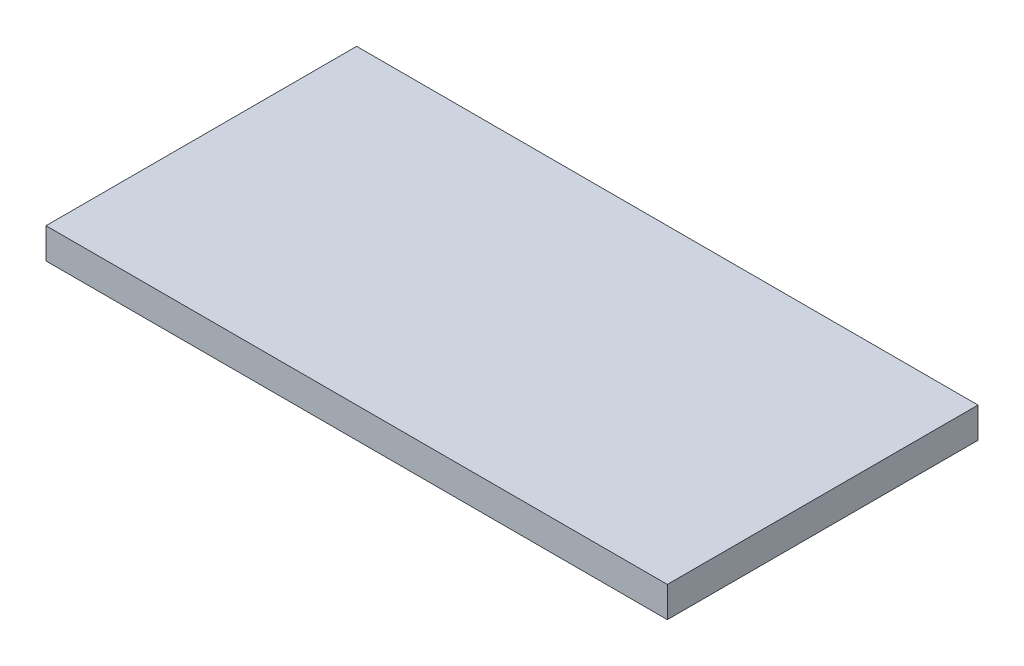
ISO-10303-21;
HEADER;
FILE_DESCRIPTION(('STEP AP214'),'2;1');
FILE_NAME('part.step','',(''),(''),'','','');
FILE_SCHEMA(('AUTOMOTIVE_DESIGN { 1 0 10303 214 1 1 1 1 }'));
ENDSEC;
DATA;
#1=APPLICATION_CONTEXT('core data for automotive mechanical design processes');
#2=APPLICATION_PROTOCOL_DEFINITION('international standard','automotive_design',2000,#1);
#3=PRODUCT_CONTEXT('',#1,'mechanical');
#4=PRODUCT('Part','Part','',(#3));
#5=PRODUCT_RELATED_PRODUCT_CATEGORY('part','',(#4));
#6=PRODUCT_DEFINITION_FORMATION('','',#4);
#7=PRODUCT_DEFINITION_CONTEXT('part definition',#1,'design');
#8=PRODUCT_DEFINITION('design','',#6,#7);
#9=PRODUCT_DEFINITION_SHAPE('','',#8);
#10=(LENGTH_UNIT() NAMED_UNIT(*) SI_UNIT(.MILLI.,.METRE.));
#11=(NAMED_UNIT(*) PLANE_ANGLE_UNIT() SI_UNIT($,.RADIAN.));
#12=(NAMED_UNIT(*) SI_UNIT($,.STERADIAN.) SOLID_ANGLE_UNIT());
#13=UNCERTAINTY_MEASURE_WITH_UNIT(LENGTH_MEASURE(1.E-05),#10,'distance_accuracy_value','');
#14=(GEOMETRIC_REPRESENTATION_CONTEXT(3) GLOBAL_UNCERTAINTY_ASSIGNED_CONTEXT((#13)) GLOBAL_UNIT_ASSIGNED_CONTEXT((#10,
#11,#12)) REPRESENTATION_CONTEXT('',''));
#15=CARTESIAN_POINT('',(0.,0.,0.));
#16=DIRECTION('',(0.,0.,1.));
#17=DIRECTION('',(1.,0.,0.));
#18=AXIS2_PLACEMENT_3D('',#15,#16,#17);
#19=CARTESIAN_POINT('',(-50.9391301805522,59.944,35.3639480629795));
#20=DIRECTION('',(1.,0.,0.));
#21=DIRECTION('',(0.,0.,1.));
#22=AXIS2_PLACEMENT_3D('',#19,#20,#21);
#23=PLANE('',#22);
#24=DIRECTION('',(0.,0.,-1.));
#25=VECTOR('',#24,1.);
#26=CARTESIAN_POINT('',(-50.9391301805522,0.,35.3639480629795));
#27=LINE('',#26,#25);
#28=CARTESIAN_POINT('',(-50.9391301805522,0.,35.3639480629795));
#29=VERTEX_POINT('',#28);
#30=CARTESIAN_POINT('',(-50.9391301805522,0.,-574.236051937021));
#31=VERTEX_POINT('',#30);
#32=EDGE_CURVE('E94',#29,#31,#27,.T.);
#33=ORIENTED_EDGE('',*,*,#32,.F.);
#34=DIRECTION('',(0.,-1.,0.));
#35=VECTOR('',#34,1.);
#36=CARTESIAN_POINT('',(-50.9391301805522,59.944,35.3639480629795));
#37=LINE('',#36,#35);
#38=CARTESIAN_POINT('',(-50.9391301805522,59.944,35.3639480629795));
#39=VERTEX_POINT('',#38);
#40=EDGE_CURVE('E93',#39,#29,#37,.T.);
#41=ORIENTED_EDGE('',*,*,#40,.F.);
#42=DIRECTION('',(0.,0.,-1.));
#43=VECTOR('',#42,1.);
#44=CARTESIAN_POINT('',(-50.9391301805522,59.944,35.3639480629795));
#45=LINE('',#44,#43);
#46=CARTESIAN_POINT('',(-50.9391301805522,59.944,-574.236051937021));
#47=VERTEX_POINT('',#46);
#48=EDGE_CURVE('E88',#39,#47,#45,.T.);
#49=ORIENTED_EDGE('',*,*,#48,.T.);
#50=DIRECTION('',(0.,-1.,0.));
#51=VECTOR('',#50,1.);
#52=CARTESIAN_POINT('',(-50.9391301805522,59.944,-574.236051937021));
#53=LINE('',#52,#51);
#54=EDGE_CURVE('E11',#47,#31,#53,.T.);
#55=ORIENTED_EDGE('',*,*,#54,.T.);
#56=EDGE_LOOP('',(#33,#41,#49,#55));
#57=FACE_BOUND('',#56,.T.);
#58=ADVANCED_FACE('F31',(#57),#23,.F.);
#59=CARTESIAN_POINT('',(-50.9391301805522,59.944,-574.236051937021));
#60=DIRECTION('',(0.,0.,1.));
#61=DIRECTION('',(-1.,0.,0.));
#62=AXIS2_PLACEMENT_3D('',#59,#60,#61);
#63=PLANE('',#62);
#64=DIRECTION('',(1.,0.,0.));
#65=VECTOR('',#64,1.);
#66=CARTESIAN_POINT('',(-50.9391301805522,0.,-574.236051937021));
#67=LINE('',#66,#65);
#68=CARTESIAN_POINT('',(1168.26086981945,0.,-574.236051937021));
#69=VERTEX_POINT('',#68);
#70=EDGE_CURVE('E96',#31,#69,#67,.T.);
#71=ORIENTED_EDGE('',*,*,#70,.F.);
#72=ORIENTED_EDGE('',*,*,#54,.F.);
#73=DIRECTION('',(1.,0.,0.));
#74=VECTOR('',#73,1.);
#75=CARTESIAN_POINT('',(-50.9391301805522,59.944,-574.236051937021));
#76=LINE('',#75,#74);
#77=CARTESIAN_POINT('',(1168.26086981945,59.944,-574.236051937021));
#78=VERTEX_POINT('',#77);
#79=EDGE_CURVE('E72',#47,#78,#76,.T.);
#80=ORIENTED_EDGE('',*,*,#79,.T.);
#81=DIRECTION('',(0.,-1.,0.));
#82=VECTOR('',#81,1.);
#83=CARTESIAN_POINT('',(1168.26086981945,59.944,-574.236051937021));
#84=LINE('',#83,#82);
#85=EDGE_CURVE('E39',#78,#69,#84,.T.);
#86=ORIENTED_EDGE('',*,*,#85,.T.);
#87=EDGE_LOOP('',(#71,#72,#80,#86));
#88=FACE_BOUND('',#87,.T.);
#89=ADVANCED_FACE('F86',(#88),#63,.F.);
#90=CARTESIAN_POINT('',(1168.26086981945,59.944,35.3639480629792));
#91=DIRECTION('',(-1.,0.,0.));
#92=DIRECTION('',(0.,0.,-1.));
#93=AXIS2_PLACEMENT_3D('',#90,#91,#92);
#94=PLANE('',#93);
#95=DIRECTION('',(0.,0.,1.));
#96=VECTOR('',#95,1.);
#97=CARTESIAN_POINT('',(1168.26086981945,0.,35.3639480629792));
#98=LINE('',#97,#96);
#99=CARTESIAN_POINT('',(1168.26086981945,0.,35.3639480629792));
#100=VERTEX_POINT('',#99);
#101=EDGE_CURVE('E82',#69,#100,#98,.T.);
#102=ORIENTED_EDGE('',*,*,#101,.F.);
#103=ORIENTED_EDGE('',*,*,#85,.F.);
#104=DIRECTION('',(0.,0.,1.));
#105=VECTOR('',#104,1.);
#106=CARTESIAN_POINT('',(1168.26086981945,59.944,35.3639480629792));
#107=LINE('',#106,#105);
#108=CARTESIAN_POINT('',(1168.26086981945,59.944,35.3639480629792));
#109=VERTEX_POINT('',#108);
#110=EDGE_CURVE('E75',#78,#109,#107,.T.);
#111=ORIENTED_EDGE('',*,*,#110,.T.);
#112=DIRECTION('',(0.,-1.,0.));
#113=VECTOR('',#112,1.);
#114=CARTESIAN_POINT('',(1168.26086981945,59.944,35.3639480629792));
#115=LINE('',#114,#113);
#116=EDGE_CURVE('E85',#109,#100,#115,.T.);
#117=ORIENTED_EDGE('',*,*,#116,.T.);
#118=EDGE_LOOP('',(#102,#103,#111,#117));
#119=FACE_BOUND('',#118,.T.);
#120=ADVANCED_FACE('F81',(#119),#94,.F.);
#121=CARTESIAN_POINT('',(-50.9391301805522,59.944,35.3639480629795));
#122=DIRECTION('',(0.,0.,-1.));
#123=DIRECTION('',(1.,0.,0.));
#124=AXIS2_PLACEMENT_3D('',#121,#122,#123);
#125=PLANE('',#124);
#126=DIRECTION('',(-1.,0.,0.));
#127=VECTOR('',#126,1.);
#128=CARTESIAN_POINT('',(-50.9391301805522,0.,35.3639480629795));
#129=LINE('',#128,#127);
#130=EDGE_CURVE('E61',#100,#29,#129,.T.);
#131=ORIENTED_EDGE('',*,*,#130,.F.);
#132=ORIENTED_EDGE('',*,*,#116,.F.);
#133=DIRECTION('',(-1.,0.,0.));
#134=VECTOR('',#133,1.);
#135=CARTESIAN_POINT('',(-50.9391301805522,59.944,35.3639480629795));
#136=LINE('',#135,#134);
#137=EDGE_CURVE('E47',#109,#39,#136,.T.);
#138=ORIENTED_EDGE('',*,*,#137,.T.);
#139=ORIENTED_EDGE('',*,*,#40,.T.);
#140=EDGE_LOOP('',(#131,#132,#138,#139));
#141=FACE_BOUND('',#140,.T.);
#142=ADVANCED_FACE('F105',(#141),#125,.F.);
#143=CARTESIAN_POINT('',(-50.9391301805522,59.944,-574.236051937021));
#144=DIRECTION('',(0.,1.,0.));
#145=DIRECTION('',(0.,0.,-1.));
#146=AXIS2_PLACEMENT_3D('',#143,#144,#145);
#147=PLANE('',#146);
#148=ORIENTED_EDGE('',*,*,#48,.F.);
#149=ORIENTED_EDGE('',*,*,#137,.F.);
#150=ORIENTED_EDGE('',*,*,#110,.F.);
#151=ORIENTED_EDGE('',*,*,#79,.F.);
#152=EDGE_LOOP('',(#148,#149,#150,#151));
#153=FACE_BOUND('',#152,.T.);
#154=ADVANCED_FACE('F77',(#153),#147,.T.);
#155=CARTESIAN_POINT('',(-50.9391301805522,0.,-574.236051937021));
#156=DIRECTION('',(0.,1.,0.));
#157=DIRECTION('',(0.,0.,-1.));
#158=AXIS2_PLACEMENT_3D('',#155,#156,#157);
#159=PLANE('',#158);
#160=ORIENTED_EDGE('',*,*,#32,.T.);
#161=ORIENTED_EDGE('',*,*,#70,.T.);
#162=ORIENTED_EDGE('',*,*,#101,.T.);
#163=ORIENTED_EDGE('',*,*,#130,.T.);
#164=EDGE_LOOP('',(#160,#161,#162,#163));
#165=FACE_BOUND('',#164,.T.);
#166=ADVANCED_FACE('F101',(#165),#159,.F.);
#167=CLOSED_SHELL('',(#58,#89,#120,#142,#154,#166));
#168=MANIFOLD_SOLID_BREP('B2',#167);
#169=ADVANCED_BREP_SHAPE_REPRESENTATION('',(#18,#168),#14);
#170=SHAPE_DEFINITION_REPRESENTATION(#9,#169);
ENDSEC;
END-ISO-10303-21;
